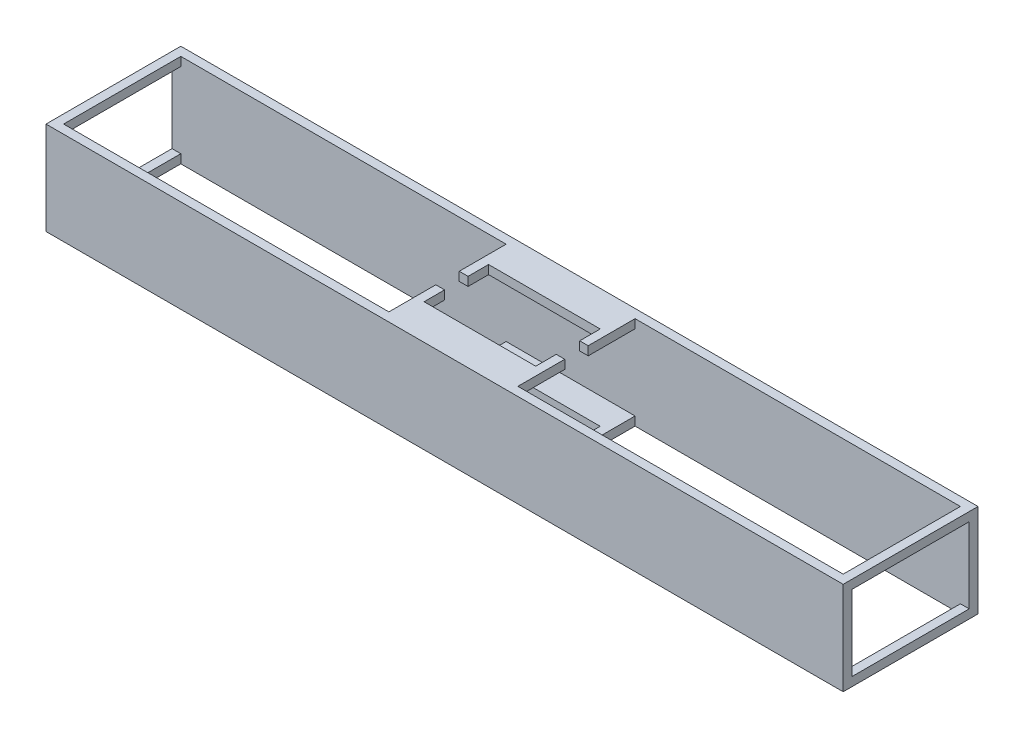
ISO-10303-21;
HEADER;
FILE_DESCRIPTION(('STEP AP214'),'2;1');
FILE_NAME('part.step','',(''),(''),'','','');
FILE_SCHEMA(('AUTOMOTIVE_DESIGN { 1 0 10303 214 1 1 1 1 }'));
ENDSEC;
DATA;
#1=APPLICATION_CONTEXT('core data for automotive mechanical design processes');
#2=APPLICATION_PROTOCOL_DEFINITION('international standard','automotive_design',2000,#1);
#3=PRODUCT_CONTEXT('',#1,'mechanical');
#4=PRODUCT('Part','Part','',(#3));
#5=PRODUCT_RELATED_PRODUCT_CATEGORY('part','',(#4));
#6=PRODUCT_DEFINITION_FORMATION('','',#4);
#7=PRODUCT_DEFINITION_CONTEXT('part definition',#1,'design');
#8=PRODUCT_DEFINITION('design','',#6,#7);
#9=PRODUCT_DEFINITION_SHAPE('','',#8);
#10=(LENGTH_UNIT() NAMED_UNIT(*) SI_UNIT(.MILLI.,.METRE.));
#11=(NAMED_UNIT(*) PLANE_ANGLE_UNIT() SI_UNIT($,.RADIAN.));
#12=(NAMED_UNIT(*) SI_UNIT($,.STERADIAN.) SOLID_ANGLE_UNIT());
#13=UNCERTAINTY_MEASURE_WITH_UNIT(LENGTH_MEASURE(1.E-05),#10,'distance_accuracy_value','');
#14=(GEOMETRIC_REPRESENTATION_CONTEXT(3) GLOBAL_UNCERTAINTY_ASSIGNED_CONTEXT((#13)) GLOBAL_UNIT_ASSIGNED_CONTEXT((#10,
#11,#12)) REPRESENTATION_CONTEXT('',''));
#15=CARTESIAN_POINT('',(0.,0.,0.));
#16=DIRECTION('',(0.,0.,1.));
#17=DIRECTION('',(1.,0.,0.));
#18=AXIS2_PLACEMENT_3D('',#15,#16,#17);
#19=CARTESIAN_POINT('',(-5.49999999999999,0.,-5.));
#20=DIRECTION('',(1.,0.,0.));
#21=DIRECTION('',(0.,0.,-1.));
#22=AXIS2_PLACEMENT_3D('',#19,#20,#21);
#23=PLANE('',#22);
#24=DIRECTION('',(0.,0.,1.));
#25=VECTOR('',#24,1.);
#26=CARTESIAN_POINT('',(-5.49999999999999,7.19,-5.));
#27=LINE('',#26,#25);
#28=CARTESIAN_POINT('',(-5.5,7.19,-5.));
#29=VERTEX_POINT('',#28);
#30=CARTESIAN_POINT('',(-5.49999999999999,7.19,-0.999999999999998));
#31=VERTEX_POINT('',#30);
#32=EDGE_CURVE('E388',#29,#31,#27,.T.);
#33=ORIENTED_EDGE('',*,*,#32,.T.);
#34=DIRECTION('',(0.,1.,0.));
#35=VECTOR('',#34,1.);
#36=CARTESIAN_POINT('',(-5.5,5.44,-0.999999999999998));
#37=LINE('',#36,#35);
#38=CARTESIAN_POINT('',(-5.5,7.94,-0.999999999999998));
#39=VERTEX_POINT('',#38);
#40=EDGE_CURVE('E47',#31,#39,#37,.T.);
#41=ORIENTED_EDGE('',*,*,#40,.T.);
#42=DIRECTION('',(0.,0.,-1.));
#43=VECTOR('',#42,1.);
#44=CARTESIAN_POINT('',(-5.49999999999999,7.94,-5.));
#45=LINE('',#44,#43);
#46=CARTESIAN_POINT('',(-5.49999999999999,7.94,-5.));
#47=VERTEX_POINT('',#46);
#48=EDGE_CURVE('E318',#39,#47,#45,.T.);
#49=ORIENTED_EDGE('',*,*,#48,.T.);
#50=DIRECTION('',(0.,1.,0.));
#51=VECTOR('',#50,1.);
#52=CARTESIAN_POINT('',(-5.49999999999999,0.,-5.));
#53=LINE('',#52,#51);
#54=EDGE_CURVE('E335',#29,#47,#53,.T.);
#55=ORIENTED_EDGE('',*,*,#54,.F.);
#56=EDGE_LOOP('',(#33,#41,#49,#55));
#57=FACE_BOUND('',#56,.T.);
#58=ADVANCED_FACE('F32',(#57),#23,.F.);
#59=CARTESIAN_POINT('',(5.50000000000001,0.,-5.));
#60=DIRECTION('',(-1.,0.,0.));
#61=DIRECTION('',(0.,0.,1.));
#62=AXIS2_PLACEMENT_3D('',#59,#60,#61);
#63=PLANE('',#62);
#64=DIRECTION('',(0.,0.,1.));
#65=VECTOR('',#64,1.);
#66=CARTESIAN_POINT('',(5.50000000000001,7.94,-5.));
#67=LINE('',#66,#65);
#68=CARTESIAN_POINT('',(5.50000000000001,7.94,-5.));
#69=VERTEX_POINT('',#68);
#70=CARTESIAN_POINT('',(5.50000000000001,7.94,-0.999999999999998));
#71=VERTEX_POINT('',#70);
#72=EDGE_CURVE('E461',#69,#71,#67,.T.);
#73=ORIENTED_EDGE('',*,*,#72,.T.);
#74=DIRECTION('',(0.,1.,0.));
#75=VECTOR('',#74,1.);
#76=CARTESIAN_POINT('',(5.50000000000001,5.44,-0.999999999999998));
#77=LINE('',#76,#75);
#78=CARTESIAN_POINT('',(5.50000000000001,7.19,-0.999999999999998));
#79=VERTEX_POINT('',#78);
#80=EDGE_CURVE('E654',#79,#71,#77,.T.);
#81=ORIENTED_EDGE('',*,*,#80,.F.);
#82=DIRECTION('',(0.,0.,-1.));
#83=VECTOR('',#82,1.);
#84=CARTESIAN_POINT('',(5.50000000000001,7.19,-5.));
#85=LINE('',#84,#83);
#86=CARTESIAN_POINT('',(5.50000000000001,7.19,-5.));
#87=VERTEX_POINT('',#86);
#88=EDGE_CURVE('E565',#79,#87,#85,.T.);
#89=ORIENTED_EDGE('',*,*,#88,.T.);
#90=DIRECTION('',(0.,1.,0.));
#91=VECTOR('',#90,1.);
#92=CARTESIAN_POINT('',(5.50000000000001,0.,-5.));
#93=LINE('',#92,#91);
#94=EDGE_CURVE('E476',#87,#69,#93,.T.);
#95=ORIENTED_EDGE('',*,*,#94,.T.);
#96=EDGE_LOOP('',(#73,#81,#89,#95));
#97=FACE_BOUND('',#96,.T.);
#98=ADVANCED_FACE('F653',(#97),#63,.F.);
#99=CARTESIAN_POINT('',(-4.75,0.,-2.75));
#100=DIRECTION('',(-1.,0.,0.));
#101=DIRECTION('',(0.,0.,1.));
#102=AXIS2_PLACEMENT_3D('',#99,#100,#101);
#103=PLANE('',#102);
#104=DIRECTION('',(0.,0.,1.));
#105=VECTOR('',#104,1.);
#106=CARTESIAN_POINT('',(-4.75,7.94,-2.75));
#107=LINE('',#106,#105);
#108=CARTESIAN_POINT('',(-4.75,7.94,-2.75));
#109=VERTEX_POINT('',#108);
#110=CARTESIAN_POINT('',(-4.75,7.94,-0.999999999999998));
#111=VERTEX_POINT('',#110);
#112=EDGE_CURVE('E419',#109,#111,#107,.T.);
#113=ORIENTED_EDGE('',*,*,#112,.T.);
#114=DIRECTION('',(0.,-1.,0.));
#115=VECTOR('',#114,1.);
#116=CARTESIAN_POINT('',(-4.75,0.,-0.999999999999998));
#117=LINE('',#116,#115);
#118=CARTESIAN_POINT('',(-4.75,7.19,-0.999999999999998));
#119=VERTEX_POINT('',#118);
#120=EDGE_CURVE('E669',#111,#119,#117,.T.);
#121=ORIENTED_EDGE('',*,*,#120,.T.);
#122=DIRECTION('',(0.,0.,-1.));
#123=VECTOR('',#122,1.);
#124=CARTESIAN_POINT('',(-4.75,7.19,-2.75));
#125=LINE('',#124,#123);
#126=CARTESIAN_POINT('',(-4.75,7.19,-2.75));
#127=VERTEX_POINT('',#126);
#128=EDGE_CURVE('E391',#119,#127,#125,.T.);
#129=ORIENTED_EDGE('',*,*,#128,.T.);
#130=DIRECTION('',(0.,1.,0.));
#131=VECTOR('',#130,1.);
#132=CARTESIAN_POINT('',(-4.75,0.,-2.75));
#133=LINE('',#132,#131);
#134=EDGE_CURVE('E435',#127,#109,#133,.T.);
#135=ORIENTED_EDGE('',*,*,#134,.T.);
#136=EDGE_LOOP('',(#113,#121,#129,#135));
#137=FACE_BOUND('',#136,.T.);
#138=ADVANCED_FACE('F668',(#137),#103,.F.);
#139=CARTESIAN_POINT('',(4.775,0.,-2.75));
#140=DIRECTION('',(1.,0.,0.));
#141=DIRECTION('',(0.,0.,-1.));
#142=AXIS2_PLACEMENT_3D('',#139,#140,#141);
#143=PLANE('',#142);
#144=DIRECTION('',(0.,0.,1.));
#145=VECTOR('',#144,1.);
#146=CARTESIAN_POINT('',(4.775,7.19,-2.75));
#147=LINE('',#146,#145);
#148=CARTESIAN_POINT('',(4.775,7.19,-2.75));
#149=VERTEX_POINT('',#148);
#150=CARTESIAN_POINT('',(4.775,7.19,-0.999999999999998));
#151=VERTEX_POINT('',#150);
#152=EDGE_CURVE('E556',#149,#151,#147,.T.);
#153=ORIENTED_EDGE('',*,*,#152,.T.);
#154=DIRECTION('',(0.,1.,0.));
#155=VECTOR('',#154,1.);
#156=CARTESIAN_POINT('',(4.775,0.,-0.999999999999998));
#157=LINE('',#156,#155);
#158=CARTESIAN_POINT('',(4.775,7.94,-0.999999999999998));
#159=VERTEX_POINT('',#158);
#160=EDGE_CURVE('E605',#151,#159,#157,.T.);
#161=ORIENTED_EDGE('',*,*,#160,.T.);
#162=DIRECTION('',(0.,0.,-1.));
#163=VECTOR('',#162,1.);
#164=CARTESIAN_POINT('',(4.775,7.94,-2.75));
#165=LINE('',#164,#163);
#166=CARTESIAN_POINT('',(4.775,7.94,-2.75));
#167=VERTEX_POINT('',#166);
#168=EDGE_CURVE('E425',#159,#167,#165,.T.);
#169=ORIENTED_EDGE('',*,*,#168,.T.);
#170=DIRECTION('',(0.,1.,0.));
#171=VECTOR('',#170,1.);
#172=CARTESIAN_POINT('',(4.775,0.,-2.75));
#173=LINE('',#172,#171);
#174=EDGE_CURVE('E439',#149,#167,#173,.T.);
#175=ORIENTED_EDGE('',*,*,#174,.F.);
#176=EDGE_LOOP('',(#153,#161,#169,#175));
#177=FACE_BOUND('',#176,.T.);
#178=ADVANCED_FACE('F660',(#177),#143,.F.);
#179=CARTESIAN_POINT('',(34.,7.19,-5.));
#180=DIRECTION('',(0.,1.,0.));
#181=DIRECTION('',(0.,0.,1.));
#182=AXIS2_PLACEMENT_3D('',#179,#180,#181);
#183=PLANE('',#182);
#184=ORIENTED_EDGE('',*,*,#88,.F.);
#185=DIRECTION('',(-1.,0.,0.));
#186=VECTOR('',#185,1.);
#187=CARTESIAN_POINT('',(34.,7.19,-0.999999999999998));
#188=LINE('',#187,#186);
#189=EDGE_CURVE('E11',#79,#151,#188,.T.);
#190=ORIENTED_EDGE('',*,*,#189,.T.);
#191=ORIENTED_EDGE('',*,*,#152,.F.);
#192=DIRECTION('',(1.,0.,0.));
#193=VECTOR('',#192,1.);
#194=CARTESIAN_POINT('',(-4.75,7.19,-2.75));
#195=LINE('',#194,#193);
#196=EDGE_CURVE('E559',#127,#149,#195,.T.);
#197=ORIENTED_EDGE('',*,*,#196,.F.);
#198=ORIENTED_EDGE('',*,*,#128,.F.);
#199=EDGE_CURVE('E36',#119,#31,#188,.T.);
#200=ORIENTED_EDGE('',*,*,#199,.T.);
#201=ORIENTED_EDGE('',*,*,#32,.F.);
#202=DIRECTION('',(-1.,0.,0.));
#203=VECTOR('',#202,1.);
#204=CARTESIAN_POINT('',(34.,7.19,-5.));
#205=LINE('',#204,#203);
#206=EDGE_CURVE('E512',#87,#29,#205,.T.);
#207=ORIENTED_EDGE('',*,*,#206,.F.);
#208=EDGE_LOOP('',(#184,#190,#191,#197,#198,#200,#201,#207));
#209=FACE_BOUND('',#208,.T.);
#210=ADVANCED_FACE('F386',(#209),#183,.F.);
#211=CARTESIAN_POINT('',(-33.25,0.,-5.));
#212=DIRECTION('',(-1.,0.,0.));
#213=DIRECTION('',(0.,0.,1.));
#214=AXIS2_PLACEMENT_3D('',#211,#212,#213);
#215=PLANE('',#214);
#216=DIRECTION('',(0.,1.,0.));
#217=VECTOR('',#216,1.);
#218=CARTESIAN_POINT('',(-33.25,0.,5.));
#219=LINE('',#218,#217);
#220=CARTESIAN_POINT('',(-33.25,7.19,5.));
#221=VERTEX_POINT('',#220);
#222=CARTESIAN_POINT('',(-33.25,7.94,5.));
#223=VERTEX_POINT('',#222);
#224=EDGE_CURVE('E342',#221,#223,#219,.T.);
#225=ORIENTED_EDGE('',*,*,#224,.F.);
#226=DIRECTION('',(0.,0.,-1.));
#227=VECTOR('',#226,1.);
#228=CARTESIAN_POINT('',(-33.25,7.19,-5.));
#229=LINE('',#228,#227);
#230=CARTESIAN_POINT('',(-33.25,7.19,-5.));
#231=VERTEX_POINT('',#230);
#232=EDGE_CURVE('E396',#221,#231,#229,.T.);
#233=ORIENTED_EDGE('',*,*,#232,.T.);
#234=DIRECTION('',(0.,1.,0.));
#235=VECTOR('',#234,1.);
#236=CARTESIAN_POINT('',(-33.25,0.,-5.));
#237=LINE('',#236,#235);
#238=CARTESIAN_POINT('',(-33.25,7.94,-5.));
#239=VERTEX_POINT('',#238);
#240=EDGE_CURVE('E331',#231,#239,#237,.T.);
#241=ORIENTED_EDGE('',*,*,#240,.T.);
#242=DIRECTION('',(0.,0.,1.));
#243=VECTOR('',#242,1.);
#244=CARTESIAN_POINT('',(-33.25,7.94,-5.));
#245=LINE('',#244,#243);
#246=EDGE_CURVE('E475',#239,#223,#245,.T.);
#247=ORIENTED_EDGE('',*,*,#246,.T.);
#248=EDGE_LOOP('',(#225,#233,#241,#247));
#249=FACE_BOUND('',#248,.T.);
#250=ADVANCED_FACE('F697',(#249),#215,.F.);
#251=CARTESIAN_POINT('',(-5.49999999999999,7.94,5.));
#252=VERTEX_POINT('',#251);
#253=CARTESIAN_POINT('',(-5.49999999999999,7.94,1.));
#254=VERTEX_POINT('',#253);
#255=EDGE_CURVE('E307',#252,#254,#45,.T.);
#256=ORIENTED_EDGE('',*,*,#255,.T.);
#257=DIRECTION('',(0.,1.,0.));
#258=VECTOR('',#257,1.);
#259=CARTESIAN_POINT('',(-5.49999999999999,5.44,1.));
#260=LINE('',#259,#258);
#261=CARTESIAN_POINT('',(-5.49999999999999,7.19,1.));
#262=VERTEX_POINT('',#261);
#263=EDGE_CURVE('E288',#262,#254,#260,.T.);
#264=ORIENTED_EDGE('',*,*,#263,.F.);
#265=CARTESIAN_POINT('',(-5.5,7.19,5.));
#266=VERTEX_POINT('',#265);
#267=EDGE_CURVE('E397',#262,#266,#27,.T.);
#268=ORIENTED_EDGE('',*,*,#267,.T.);
#269=DIRECTION('',(0.,1.,0.));
#270=VECTOR('',#269,1.);
#271=CARTESIAN_POINT('',(-5.49999999999999,0.,5.));
#272=LINE('',#271,#270);
#273=EDGE_CURVE('E315',#266,#252,#272,.T.);
#274=ORIENTED_EDGE('',*,*,#273,.T.);
#275=EDGE_LOOP('',(#256,#264,#268,#274));
#276=FACE_BOUND('',#275,.T.);
#277=ADVANCED_FACE('F313',(#276),#23,.F.);
#278=CARTESIAN_POINT('',(5.50000000000001,7.19,5.));
#279=VERTEX_POINT('',#278);
#280=CARTESIAN_POINT('',(5.50000000000001,7.19,1.));
#281=VERTEX_POINT('',#280);
#282=EDGE_CURVE('E401',#279,#281,#85,.T.);
#283=ORIENTED_EDGE('',*,*,#282,.T.);
#284=DIRECTION('',(0.,1.,0.));
#285=VECTOR('',#284,1.);
#286=CARTESIAN_POINT('',(5.50000000000001,5.44,1.));
#287=LINE('',#286,#285);
#288=CARTESIAN_POINT('',(5.50000000000001,7.94,1.));
#289=VERTEX_POINT('',#288);
#290=EDGE_CURVE('E55',#281,#289,#287,.T.);
#291=ORIENTED_EDGE('',*,*,#290,.T.);
#292=CARTESIAN_POINT('',(5.50000000000001,7.94,5.));
#293=VERTEX_POINT('',#292);
#294=EDGE_CURVE('E434',#289,#293,#67,.T.);
#295=ORIENTED_EDGE('',*,*,#294,.T.);
#296=DIRECTION('',(0.,1.,0.));
#297=VECTOR('',#296,1.);
#298=CARTESIAN_POINT('',(5.50000000000001,0.,5.));
#299=LINE('',#298,#297);
#300=EDGE_CURVE('E460',#279,#293,#299,.T.);
#301=ORIENTED_EDGE('',*,*,#300,.F.);
#302=EDGE_LOOP('',(#283,#291,#295,#301));
#303=FACE_BOUND('',#302,.T.);
#304=ADVANCED_FACE('F573',(#303),#63,.F.);
#305=CARTESIAN_POINT('',(33.25,0.,-5.));
#306=DIRECTION('',(1.,0.,0.));
#307=DIRECTION('',(0.,0.,-1.));
#308=AXIS2_PLACEMENT_3D('',#305,#306,#307);
#309=PLANE('',#308);
#310=DIRECTION('',(0.,1.,0.));
#311=VECTOR('',#310,1.);
#312=CARTESIAN_POINT('',(33.25,0.,-5.));
#313=LINE('',#312,#311);
#314=CARTESIAN_POINT('',(33.25,7.19,-5.));
#315=VERTEX_POINT('',#314);
#316=CARTESIAN_POINT('',(33.25,7.94,-5.));
#317=VERTEX_POINT('',#316);
#318=EDGE_CURVE('E480',#315,#317,#313,.T.);
#319=ORIENTED_EDGE('',*,*,#318,.F.);
#320=DIRECTION('',(0.,0.,1.));
#321=VECTOR('',#320,1.);
#322=CARTESIAN_POINT('',(33.25,7.19,-5.));
#323=LINE('',#322,#321);
#324=CARTESIAN_POINT('',(33.25,7.19,5.));
#325=VERTEX_POINT('',#324);
#326=EDGE_CURVE('E563',#315,#325,#323,.T.);
#327=ORIENTED_EDGE('',*,*,#326,.T.);
#328=DIRECTION('',(0.,1.,0.));
#329=VECTOR('',#328,1.);
#330=CARTESIAN_POINT('',(33.25,0.,5.));
#331=LINE('',#330,#329);
#332=CARTESIAN_POINT('',(33.25,7.94,5.));
#333=VERTEX_POINT('',#332);
#334=EDGE_CURVE('E484',#325,#333,#331,.T.);
#335=ORIENTED_EDGE('',*,*,#334,.T.);
#336=DIRECTION('',(0.,0.,-1.));
#337=VECTOR('',#336,1.);
#338=CARTESIAN_POINT('',(33.25,7.94,-5.));
#339=LINE('',#338,#337);
#340=EDGE_CURVE('E467',#333,#317,#339,.T.);
#341=ORIENTED_EDGE('',*,*,#340,.T.);
#342=EDGE_LOOP('',(#319,#327,#335,#341));
#343=FACE_BOUND('',#342,.T.);
#344=ADVANCED_FACE('F647',(#343),#309,.F.);
#345=CARTESIAN_POINT('',(-4.75,7.19,2.75));
#346=VERTEX_POINT('',#345);
#347=CARTESIAN_POINT('',(-4.75,7.19,1.));
#348=VERTEX_POINT('',#347);
#349=EDGE_CURVE('E562',#346,#348,#125,.T.);
#350=ORIENTED_EDGE('',*,*,#349,.T.);
#351=DIRECTION('',(0.,1.,0.));
#352=VECTOR('',#351,1.);
#353=CARTESIAN_POINT('',(-4.75,0.,1.));
#354=LINE('',#353,#352);
#355=CARTESIAN_POINT('',(-4.75,7.94,1.));
#356=VERTEX_POINT('',#355);
#357=EDGE_CURVE('E670',#348,#356,#354,.T.);
#358=ORIENTED_EDGE('',*,*,#357,.T.);
#359=CARTESIAN_POINT('',(-4.75,7.94,2.75));
#360=VERTEX_POINT('',#359);
#361=EDGE_CURVE('E309',#356,#360,#107,.T.);
#362=ORIENTED_EDGE('',*,*,#361,.T.);
#363=DIRECTION('',(0.,1.,0.));
#364=VECTOR('',#363,1.);
#365=CARTESIAN_POINT('',(-4.75,0.,2.75));
#366=LINE('',#365,#364);
#367=EDGE_CURVE('E418',#346,#360,#366,.T.);
#368=ORIENTED_EDGE('',*,*,#367,.F.);
#369=EDGE_LOOP('',(#350,#358,#362,#368));
#370=FACE_BOUND('',#369,.T.);
#371=ADVANCED_FACE('F718',(#370),#103,.F.);
#372=CARTESIAN_POINT('',(-4.75,0.,-2.75));
#373=DIRECTION('',(0.,0.,-1.));
#374=DIRECTION('',(-1.,0.,0.));
#375=AXIS2_PLACEMENT_3D('',#372,#373,#374);
#376=PLANE('',#375);
#377=ORIENTED_EDGE('',*,*,#134,.F.);
#378=ORIENTED_EDGE('',*,*,#196,.T.);
#379=ORIENTED_EDGE('',*,*,#174,.T.);
#380=DIRECTION('',(-1.,0.,0.));
#381=VECTOR('',#380,1.);
#382=CARTESIAN_POINT('',(-4.75,7.94,-2.75));
#383=LINE('',#382,#381);
#384=EDGE_CURVE('E409',#167,#109,#383,.T.);
#385=ORIENTED_EDGE('',*,*,#384,.T.);
#386=EDGE_LOOP('',(#377,#378,#379,#385));
#387=FACE_BOUND('',#386,.T.);
#388=ADVANCED_FACE('F665',(#387),#376,.F.);
#389=CARTESIAN_POINT('',(4.775,7.94,2.75));
#390=VERTEX_POINT('',#389);
#391=CARTESIAN_POINT('',(4.775,7.94,1.));
#392=VERTEX_POINT('',#391);
#393=EDGE_CURVE('E426',#390,#392,#165,.T.);
#394=ORIENTED_EDGE('',*,*,#393,.T.);
#395=DIRECTION('',(0.,-1.,0.));
#396=VECTOR('',#395,1.);
#397=CARTESIAN_POINT('',(4.775,0.,1.));
#398=LINE('',#397,#396);
#399=CARTESIAN_POINT('',(4.775,7.19,1.));
#400=VERTEX_POINT('',#399);
#401=EDGE_CURVE('E671',#392,#400,#398,.T.);
#402=ORIENTED_EDGE('',*,*,#401,.T.);
#403=CARTESIAN_POINT('',(4.775,7.19,2.75));
#404=VERTEX_POINT('',#403);
#405=EDGE_CURVE('E555',#400,#404,#147,.T.);
#406=ORIENTED_EDGE('',*,*,#405,.T.);
#407=DIRECTION('',(0.,1.,0.));
#408=VECTOR('',#407,1.);
#409=CARTESIAN_POINT('',(4.775,0.,2.75));
#410=LINE('',#409,#408);
#411=EDGE_CURVE('E443',#404,#390,#410,.T.);
#412=ORIENTED_EDGE('',*,*,#411,.T.);
#413=EDGE_LOOP('',(#394,#402,#406,#412));
#414=FACE_BOUND('',#413,.T.);
#415=ADVANCED_FACE('F728',(#414),#143,.F.);
#416=CARTESIAN_POINT('',(-4.75,0.,2.75));
#417=DIRECTION('',(0.,0.,1.));
#418=DIRECTION('',(1.,0.,0.));
#419=AXIS2_PLACEMENT_3D('',#416,#417,#418);
#420=PLANE('',#419);
#421=ORIENTED_EDGE('',*,*,#411,.F.);
#422=DIRECTION('',(-1.,0.,0.));
#423=VECTOR('',#422,1.);
#424=CARTESIAN_POINT('',(-4.75,7.19,2.75));
#425=LINE('',#424,#423);
#426=EDGE_CURVE('E375',#404,#346,#425,.T.);
#427=ORIENTED_EDGE('',*,*,#426,.T.);
#428=ORIENTED_EDGE('',*,*,#367,.T.);
#429=DIRECTION('',(1.,0.,0.));
#430=VECTOR('',#429,1.);
#431=CARTESIAN_POINT('',(-4.75,7.94,2.75));
#432=LINE('',#431,#430);
#433=EDGE_CURVE('E422',#360,#390,#432,.T.);
#434=ORIENTED_EDGE('',*,*,#433,.T.);
#435=EDGE_LOOP('',(#421,#427,#428,#434));
#436=FACE_BOUND('',#435,.T.);
#437=ADVANCED_FACE('F724',(#436),#420,.F.);
#438=CARTESIAN_POINT('',(34.,7.94,5.75));
#439=DIRECTION('',(-1.,0.,0.));
#440=DIRECTION('',(0.,0.,1.));
#441=AXIS2_PLACEMENT_3D('',#438,#439,#440);
#442=PLANE('',#441);
#443=DIRECTION('',(0.,0.,-1.));
#444=VECTOR('',#443,1.);
#445=CARTESIAN_POINT('',(34.,7.19,-5.));
#446=LINE('',#445,#444);
#447=CARTESIAN_POINT('',(34.,7.19,5.));
#448=VERTEX_POINT('',#447);
#449=CARTESIAN_POINT('',(34.,7.19,-5.));
#450=VERTEX_POINT('',#449);
#451=EDGE_CURVE('E610',#448,#450,#446,.T.);
#452=ORIENTED_EDGE('',*,*,#451,.T.);
#453=DIRECTION('',(0.,-1.,0.));
#454=VECTOR('',#453,1.);
#455=CARTESIAN_POINT('',(34.,7.19,-5.));
#456=LINE('',#455,#454);
#457=CARTESIAN_POINT('',(34.,0.750000000000001,-5.));
#458=VERTEX_POINT('',#457);
#459=EDGE_CURVE('E594',#450,#458,#456,.T.);
#460=ORIENTED_EDGE('',*,*,#459,.T.);
#461=DIRECTION('',(0.,0.,1.));
#462=VECTOR('',#461,1.);
#463=CARTESIAN_POINT('',(34.,0.750000000000001,-5.));
#464=LINE('',#463,#462);
#465=CARTESIAN_POINT('',(34.,0.750000000000001,5.));
#466=VERTEX_POINT('',#465);
#467=EDGE_CURVE('E596',#458,#466,#464,.T.);
#468=ORIENTED_EDGE('',*,*,#467,.T.);
#469=DIRECTION('',(0.,1.,0.));
#470=VECTOR('',#469,1.);
#471=CARTESIAN_POINT('',(34.,7.19,5.));
#472=LINE('',#471,#470);
#473=EDGE_CURVE('E602',#466,#448,#472,.T.);
#474=ORIENTED_EDGE('',*,*,#473,.T.);
#475=EDGE_LOOP('',(#452,#460,#468,#474));
#476=FACE_BOUND('',#475,.T.);
#477=DIRECTION('',(0.,0.,-1.));
#478=VECTOR('',#477,1.);
#479=CARTESIAN_POINT('',(34.,0.,5.75));
#480=LINE('',#479,#478);
#481=CARTESIAN_POINT('',(34.,0.,5.75));
#482=VERTEX_POINT('',#481);
#483=CARTESIAN_POINT('',(34.,0.,-5.75));
#484=VERTEX_POINT('',#483);
#485=EDGE_CURVE('E330',#482,#484,#480,.T.);
#486=ORIENTED_EDGE('',*,*,#485,.T.);
#487=DIRECTION('',(0.,-1.,0.));
#488=VECTOR('',#487,1.);
#489=CARTESIAN_POINT('',(34.,7.94,-5.75));
#490=LINE('',#489,#488);
#491=CARTESIAN_POINT('',(34.,7.94,-5.75));
#492=VERTEX_POINT('',#491);
#493=EDGE_CURVE('E369',#492,#484,#490,.T.);
#494=ORIENTED_EDGE('',*,*,#493,.F.);
#495=DIRECTION('',(0.,0.,-1.));
#496=VECTOR('',#495,1.);
#497=CARTESIAN_POINT('',(34.,7.94,5.75));
#498=LINE('',#497,#496);
#499=CARTESIAN_POINT('',(34.,7.94,5.75));
#500=VERTEX_POINT('',#499);
#501=EDGE_CURVE('E343',#500,#492,#498,.T.);
#502=ORIENTED_EDGE('',*,*,#501,.F.);
#503=DIRECTION('',(0.,-1.,0.));
#504=VECTOR('',#503,1.);
#505=CARTESIAN_POINT('',(34.,7.94,5.75));
#506=LINE('',#505,#504);
#507=EDGE_CURVE('E353',#500,#482,#506,.T.);
#508=ORIENTED_EDGE('',*,*,#507,.T.);
#509=EDGE_LOOP('',(#486,#494,#502,#508));
#510=FACE_BOUND('',#509,.T.);
#511=ADVANCED_FACE('F34',(#476,#510),#442,.F.);
#512=CARTESIAN_POINT('',(-34.,7.94,-5.75));
#513=DIRECTION('',(0.,0.,1.));
#514=DIRECTION('',(1.,0.,0.));
#515=AXIS2_PLACEMENT_3D('',#512,#513,#514);
#516=PLANE('',#515);
#517=DIRECTION('',(-1.,0.,0.));
#518=VECTOR('',#517,1.);
#519=CARTESIAN_POINT('',(-34.,0.,-5.75));
#520=LINE('',#519,#518);
#521=CARTESIAN_POINT('',(-34.,0.,-5.75));
#522=VERTEX_POINT('',#521);
#523=EDGE_CURVE('E356',#484,#522,#520,.T.);
#524=ORIENTED_EDGE('',*,*,#523,.T.);
#525=DIRECTION('',(0.,-1.,0.));
#526=VECTOR('',#525,1.);
#527=CARTESIAN_POINT('',(-34.,7.94,-5.75));
#528=LINE('',#527,#526);
#529=CARTESIAN_POINT('',(-34.,7.94,-5.75));
#530=VERTEX_POINT('',#529);
#531=EDGE_CURVE('E366',#530,#522,#528,.T.);
#532=ORIENTED_EDGE('',*,*,#531,.F.);
#533=DIRECTION('',(-1.,0.,0.));
#534=VECTOR('',#533,1.);
#535=CARTESIAN_POINT('',(-34.,7.94,-5.75));
#536=LINE('',#535,#534);
#537=EDGE_CURVE('E346',#492,#530,#536,.T.);
#538=ORIENTED_EDGE('',*,*,#537,.F.);
#539=ORIENTED_EDGE('',*,*,#493,.T.);
#540=EDGE_LOOP('',(#524,#532,#538,#539));
#541=FACE_BOUND('',#540,.T.);
#542=ADVANCED_FACE('F768',(#541),#516,.F.);
#543=CARTESIAN_POINT('',(-34.,7.94,5.75));
#544=DIRECTION('',(1.,0.,0.));
#545=DIRECTION('',(0.,0.,-1.));
#546=AXIS2_PLACEMENT_3D('',#543,#544,#545);
#547=PLANE('',#546);
#548=DIRECTION('',(0.,0.,1.));
#549=VECTOR('',#548,1.);
#550=CARTESIAN_POINT('',(-34.,0.750000000000001,-5.));
#551=LINE('',#550,#549);
#552=CARTESIAN_POINT('',(-34.,0.750000000000001,-5.));
#553=VERTEX_POINT('',#552);
#554=CARTESIAN_POINT('',(-34.,0.750000000000001,5.));
#555=VERTEX_POINT('',#554);
#556=EDGE_CURVE('E590',#553,#555,#551,.T.);
#557=ORIENTED_EDGE('',*,*,#556,.F.);
#558=DIRECTION('',(0.,-1.,0.));
#559=VECTOR('',#558,1.);
#560=CARTESIAN_POINT('',(-34.,7.19,-5.));
#561=LINE('',#560,#559);
#562=CARTESIAN_POINT('',(-34.,7.19,-5.));
#563=VERTEX_POINT('',#562);
#564=EDGE_CURVE('E593',#563,#553,#561,.T.);
#565=ORIENTED_EDGE('',*,*,#564,.F.);
#566=DIRECTION('',(0.,0.,-1.));
#567=VECTOR('',#566,1.);
#568=CARTESIAN_POINT('',(-34.,7.19,-5.));
#569=LINE('',#568,#567);
#570=CARTESIAN_POINT('',(-34.,7.19,5.));
#571=VERTEX_POINT('',#570);
#572=EDGE_CURVE('E521',#571,#563,#569,.T.);
#573=ORIENTED_EDGE('',*,*,#572,.F.);
#574=DIRECTION('',(0.,1.,0.));
#575=VECTOR('',#574,1.);
#576=CARTESIAN_POINT('',(-34.,7.19,5.));
#577=LINE('',#576,#575);
#578=EDGE_CURVE('E586',#555,#571,#577,.T.);
#579=ORIENTED_EDGE('',*,*,#578,.F.);
#580=EDGE_LOOP('',(#557,#565,#573,#579));
#581=FACE_BOUND('',#580,.T.);
#582=DIRECTION('',(0.,0.,1.));
#583=VECTOR('',#582,1.);
#584=CARTESIAN_POINT('',(-34.,0.,5.75));
#585=LINE('',#584,#583);
#586=CARTESIAN_POINT('',(-34.,0.,5.75));
#587=VERTEX_POINT('',#586);
#588=EDGE_CURVE('E358',#522,#587,#585,.T.);
#589=ORIENTED_EDGE('',*,*,#588,.T.);
#590=DIRECTION('',(0.,-1.,0.));
#591=VECTOR('',#590,1.);
#592=CARTESIAN_POINT('',(-34.,7.94,5.75));
#593=LINE('',#592,#591);
#594=CARTESIAN_POINT('',(-34.,7.94,5.75));
#595=VERTEX_POINT('',#594);
#596=EDGE_CURVE('E363',#595,#587,#593,.T.);
#597=ORIENTED_EDGE('',*,*,#596,.F.);
#598=DIRECTION('',(0.,0.,1.));
#599=VECTOR('',#598,1.);
#600=CARTESIAN_POINT('',(-34.,7.94,5.75));
#601=LINE('',#600,#599);
#602=EDGE_CURVE('E349',#530,#595,#601,.T.);
#603=ORIENTED_EDGE('',*,*,#602,.F.);
#604=ORIENTED_EDGE('',*,*,#531,.T.);
#605=EDGE_LOOP('',(#589,#597,#603,#604));
#606=FACE_BOUND('',#605,.T.);
#607=ADVANCED_FACE('F591',(#581,#606),#547,.F.);
#608=CARTESIAN_POINT('',(-34.,7.94,5.75));
#609=DIRECTION('',(0.,0.,-1.));
#610=DIRECTION('',(-1.,0.,0.));
#611=AXIS2_PLACEMENT_3D('',#608,#609,#610);
#612=PLANE('',#611);
#613=DIRECTION('',(1.,0.,0.));
#614=VECTOR('',#613,1.);
#615=CARTESIAN_POINT('',(-34.,0.,5.75));
#616=LINE('',#615,#614);
#617=EDGE_CURVE('E347',#587,#482,#616,.T.);
#618=ORIENTED_EDGE('',*,*,#617,.T.);
#619=ORIENTED_EDGE('',*,*,#507,.F.);
#620=DIRECTION('',(1.,0.,0.));
#621=VECTOR('',#620,1.);
#622=CARTESIAN_POINT('',(-34.,7.94,5.75));
#623=LINE('',#622,#621);
#624=EDGE_CURVE('E351',#595,#500,#623,.T.);
#625=ORIENTED_EDGE('',*,*,#624,.F.);
#626=ORIENTED_EDGE('',*,*,#596,.T.);
#627=EDGE_LOOP('',(#618,#619,#625,#626));
#628=FACE_BOUND('',#627,.T.);
#629=ADVANCED_FACE('F761',(#628),#612,.F.);
#630=CARTESIAN_POINT('',(0.,7.94,0.));
#631=DIRECTION('',(0.,-1.,0.));
#632=DIRECTION('',(0.,0.,-1.));
#633=AXIS2_PLACEMENT_3D('',#630,#631,#632);
#634=PLANE('',#633);
#635=ORIENTED_EDGE('',*,*,#48,.F.);
#636=DIRECTION('',(-1.,0.,0.));
#637=VECTOR('',#636,1.);
#638=CARTESIAN_POINT('',(-5.5,7.94,-0.999999999999998));
#639=LINE('',#638,#637);
#640=EDGE_CURVE('E310',#111,#39,#639,.T.);
#641=ORIENTED_EDGE('',*,*,#640,.F.);
#642=ORIENTED_EDGE('',*,*,#112,.F.);
#643=ORIENTED_EDGE('',*,*,#384,.F.);
#644=ORIENTED_EDGE('',*,*,#168,.F.);
#645=EDGE_CURVE('E298',#71,#159,#639,.T.);
#646=ORIENTED_EDGE('',*,*,#645,.F.);
#647=ORIENTED_EDGE('',*,*,#72,.F.);
#648=DIRECTION('',(-1.,0.,0.));
#649=VECTOR('',#648,1.);
#650=CARTESIAN_POINT('',(5.50000000000001,7.94,-5.));
#651=LINE('',#650,#649);
#652=EDGE_CURVE('E451',#317,#69,#651,.T.);
#653=ORIENTED_EDGE('',*,*,#652,.F.);
#654=ORIENTED_EDGE('',*,*,#340,.F.);
#655=DIRECTION('',(1.,0.,0.));
#656=VECTOR('',#655,1.);
#657=CARTESIAN_POINT('',(5.50000000000001,7.94,5.));
#658=LINE('',#657,#656);
#659=EDGE_CURVE('E464',#293,#333,#658,.T.);
#660=ORIENTED_EDGE('',*,*,#659,.F.);
#661=ORIENTED_EDGE('',*,*,#294,.F.);
#662=DIRECTION('',(1.,0.,0.));
#663=VECTOR('',#662,1.);
#664=CARTESIAN_POINT('',(-5.49999999999999,7.94,1.));
#665=LINE('',#664,#663);
#666=EDGE_CURVE('E311',#392,#289,#665,.T.);
#667=ORIENTED_EDGE('',*,*,#666,.F.);
#668=ORIENTED_EDGE('',*,*,#393,.F.);
#669=ORIENTED_EDGE('',*,*,#433,.F.);
#670=ORIENTED_EDGE('',*,*,#361,.F.);
#671=EDGE_CURVE('E291',#254,#356,#665,.T.);
#672=ORIENTED_EDGE('',*,*,#671,.F.);
#673=ORIENTED_EDGE('',*,*,#255,.F.);
#674=DIRECTION('',(1.,0.,0.));
#675=VECTOR('',#674,1.);
#676=CARTESIAN_POINT('',(-33.25,7.94,5.));
#677=LINE('',#676,#675);
#678=EDGE_CURVE('E323',#223,#252,#677,.T.);
#679=ORIENTED_EDGE('',*,*,#678,.F.);
#680=ORIENTED_EDGE('',*,*,#246,.F.);
#681=DIRECTION('',(-1.,0.,0.));
#682=VECTOR('',#681,1.);
#683=CARTESIAN_POINT('',(-33.25,7.94,-5.));
#684=LINE('',#683,#682);
#685=EDGE_CURVE('E317',#47,#239,#684,.T.);
#686=ORIENTED_EDGE('',*,*,#685,.F.);
#687=EDGE_LOOP('',(#635,#641,#642,#643,#644,#646,#647,#653,#654,#660,#661,#667,#668,#669,#670,
#672,#673,#679,#680,#686));
#688=FACE_BOUND('',#687,.T.);
#689=ORIENTED_EDGE('',*,*,#501,.T.);
#690=ORIENTED_EDGE('',*,*,#537,.T.);
#691=ORIENTED_EDGE('',*,*,#602,.T.);
#692=ORIENTED_EDGE('',*,*,#624,.T.);
#693=EDGE_LOOP('',(#689,#690,#691,#692));
#694=FACE_BOUND('',#693,.T.);
#695=ADVANCED_FACE('F304',(#688,#694),#634,.F.);
#696=CARTESIAN_POINT('',(0.,0.,0.));
#697=DIRECTION('',(0.,-1.,0.));
#698=DIRECTION('',(0.,0.,-1.));
#699=AXIS2_PLACEMENT_3D('',#696,#697,#698);
#700=PLANE('',#699);
#701=DIRECTION('',(0.,0.,1.));
#702=VECTOR('',#701,1.);
#703=CARTESIAN_POINT('',(-4.75,0.,-2.75));
#704=LINE('',#703,#702);
#705=CARTESIAN_POINT('',(-4.75,0.,-2.75));
#706=VERTEX_POINT('',#705);
#707=CARTESIAN_POINT('',(-4.75,0.,2.75));
#708=VERTEX_POINT('',#707);
#709=EDGE_CURVE('E405',#706,#708,#704,.T.);
#710=ORIENTED_EDGE('',*,*,#709,.T.);
#711=DIRECTION('',(1.,0.,0.));
#712=VECTOR('',#711,1.);
#713=CARTESIAN_POINT('',(-4.75,0.,2.75));
#714=LINE('',#713,#712);
#715=CARTESIAN_POINT('',(4.775,0.,2.75));
#716=VERTEX_POINT('',#715);
#717=EDGE_CURVE('E408',#708,#716,#714,.T.);
#718=ORIENTED_EDGE('',*,*,#717,.T.);
#719=DIRECTION('',(0.,0.,-1.));
#720=VECTOR('',#719,1.);
#721=CARTESIAN_POINT('',(4.775,0.,-2.75));
#722=LINE('',#721,#720);
#723=CARTESIAN_POINT('',(4.775,0.,-2.75));
#724=VERTEX_POINT('',#723);
#725=EDGE_CURVE('E412',#716,#724,#722,.T.);
#726=ORIENTED_EDGE('',*,*,#725,.T.);
#727=DIRECTION('',(-1.,0.,0.));
#728=VECTOR('',#727,1.);
#729=CARTESIAN_POINT('',(-4.75,0.,-2.75));
#730=LINE('',#729,#728);
#731=EDGE_CURVE('E415',#724,#706,#730,.T.);
#732=ORIENTED_EDGE('',*,*,#731,.T.);
#733=EDGE_LOOP('',(#710,#718,#726,#732));
#734=FACE_BOUND('',#733,.T.);
#735=DIRECTION('',(0.,0.,1.));
#736=VECTOR('',#735,1.);
#737=CARTESIAN_POINT('',(5.50000000000001,0.,-5.));
#738=LINE('',#737,#736);
#739=CARTESIAN_POINT('',(5.50000000000001,0.,-5.));
#740=VERTEX_POINT('',#739);
#741=CARTESIAN_POINT('',(5.50000000000001,0.,5.));
#742=VERTEX_POINT('',#741);
#743=EDGE_CURVE('E447',#740,#742,#738,.T.);
#744=ORIENTED_EDGE('',*,*,#743,.T.);
#745=DIRECTION('',(1.,0.,0.));
#746=VECTOR('',#745,1.);
#747=CARTESIAN_POINT('',(5.50000000000001,0.,5.));
#748=LINE('',#747,#746);
#749=CARTESIAN_POINT('',(33.25,0.,5.));
#750=VERTEX_POINT('',#749);
#751=EDGE_CURVE('E450',#742,#750,#748,.T.);
#752=ORIENTED_EDGE('',*,*,#751,.T.);
#753=DIRECTION('',(0.,0.,-1.));
#754=VECTOR('',#753,1.);
#755=CARTESIAN_POINT('',(33.25,0.,-5.));
#756=LINE('',#755,#754);
#757=CARTESIAN_POINT('',(33.25,0.,-5.));
#758=VERTEX_POINT('',#757);
#759=EDGE_CURVE('E454',#750,#758,#756,.T.);
#760=ORIENTED_EDGE('',*,*,#759,.T.);
#761=DIRECTION('',(-1.,0.,0.));
#762=VECTOR('',#761,1.);
#763=CARTESIAN_POINT('',(5.50000000000001,0.,-5.));
#764=LINE('',#763,#762);
#765=EDGE_CURVE('E457',#758,#740,#764,.T.);
#766=ORIENTED_EDGE('',*,*,#765,.T.);
#767=EDGE_LOOP('',(#744,#752,#760,#766));
#768=FACE_BOUND('',#767,.T.);
#769=DIRECTION('',(0.,0.,1.));
#770=VECTOR('',#769,1.);
#771=CARTESIAN_POINT('',(-33.25,0.,-5.));
#772=LINE('',#771,#770);
#773=CARTESIAN_POINT('',(-33.25,0.,-5.));
#774=VERTEX_POINT('',#773);
#775=CARTESIAN_POINT('',(-33.25,0.,5.));
#776=VERTEX_POINT('',#775);
#777=EDGE_CURVE('E321',#774,#776,#772,.T.);
#778=ORIENTED_EDGE('',*,*,#777,.T.);
#779=DIRECTION('',(1.,0.,0.));
#780=VECTOR('',#779,1.);
#781=CARTESIAN_POINT('',(-33.25,0.,5.));
#782=LINE('',#781,#780);
#783=CARTESIAN_POINT('',(-5.49999999999999,0.,5.));
#784=VERTEX_POINT('',#783);
#785=EDGE_CURVE('E490',#776,#784,#782,.T.);
#786=ORIENTED_EDGE('',*,*,#785,.T.);
#787=DIRECTION('',(0.,0.,-1.));
#788=VECTOR('',#787,1.);
#789=CARTESIAN_POINT('',(-5.49999999999999,0.,-5.));
#790=LINE('',#789,#788);
#791=CARTESIAN_POINT('',(-5.49999999999999,0.,-5.));
#792=VERTEX_POINT('',#791);
#793=EDGE_CURVE('E493',#784,#792,#790,.T.);
#794=ORIENTED_EDGE('',*,*,#793,.T.);
#795=DIRECTION('',(-1.,0.,0.));
#796=VECTOR('',#795,1.);
#797=CARTESIAN_POINT('',(-33.25,0.,-5.));
#798=LINE('',#797,#796);
#799=EDGE_CURVE('E496',#792,#774,#798,.T.);
#800=ORIENTED_EDGE('',*,*,#799,.T.);
#801=EDGE_LOOP('',(#778,#786,#794,#800));
#802=FACE_BOUND('',#801,.T.);
#803=ORIENTED_EDGE('',*,*,#485,.F.);
#804=ORIENTED_EDGE('',*,*,#617,.F.);
#805=ORIENTED_EDGE('',*,*,#588,.F.);
#806=ORIENTED_EDGE('',*,*,#523,.F.);
#807=EDGE_LOOP('',(#803,#804,#805,#806));
#808=FACE_BOUND('',#807,.T.);
#809=ADVANCED_FACE('F627',(#734,#768,#802,#808),#700,.T.);
#810=CARTESIAN_POINT('',(-33.25,0.750000000000001,-5.));
#811=VERTEX_POINT('',#810);
#812=EDGE_CURVE('E327',#774,#811,#237,.T.);
#813=ORIENTED_EDGE('',*,*,#812,.T.);
#814=DIRECTION('',(0.,0.,1.));
#815=VECTOR('',#814,1.);
#816=CARTESIAN_POINT('',(-33.25,0.750000000000001,-5.));
#817=LINE('',#816,#815);
#818=CARTESIAN_POINT('',(-33.25,0.750000000000001,5.));
#819=VERTEX_POINT('',#818);
#820=EDGE_CURVE('E552',#811,#819,#817,.T.);
#821=ORIENTED_EDGE('',*,*,#820,.T.);
#822=EDGE_CURVE('E339',#776,#819,#219,.T.);
#823=ORIENTED_EDGE('',*,*,#822,.F.);
#824=ORIENTED_EDGE('',*,*,#777,.F.);
#825=EDGE_LOOP('',(#813,#821,#823,#824));
#826=FACE_BOUND('',#825,.T.);
#827=ADVANCED_FACE('F703',(#826),#215,.F.);
#828=CARTESIAN_POINT('',(-33.25,0.,-5.));
#829=DIRECTION('',(0.,0.,-1.));
#830=DIRECTION('',(-1.,0.,0.));
#831=AXIS2_PLACEMENT_3D('',#828,#829,#830);
#832=PLANE('',#831);
#833=CARTESIAN_POINT('',(-5.49999999999999,0.750000000000001,-5.));
#834=VERTEX_POINT('',#833);
#835=EDGE_CURVE('E332',#792,#834,#53,.T.);
#836=ORIENTED_EDGE('',*,*,#835,.T.);
#837=DIRECTION('',(-1.,0.,0.));
#838=VECTOR('',#837,1.);
#839=CARTESIAN_POINT('',(34.,0.750000000000001,-5.));
#840=LINE('',#839,#838);
#841=CARTESIAN_POINT('',(5.50000000000001,0.750000000000001,-5.));
#842=VERTEX_POINT('',#841);
#843=EDGE_CURVE('E533',#842,#834,#840,.T.);
#844=ORIENTED_EDGE('',*,*,#843,.F.);
#845=EDGE_CURVE('E472',#740,#842,#93,.T.);
#846=ORIENTED_EDGE('',*,*,#845,.F.);
#847=ORIENTED_EDGE('',*,*,#765,.F.);
#848=CARTESIAN_POINT('',(33.25,0.750000000000001,-5.));
#849=VERTEX_POINT('',#848);
#850=EDGE_CURVE('E477',#758,#849,#313,.T.);
#851=ORIENTED_EDGE('',*,*,#850,.T.);
#852=EDGE_CURVE('E531',#458,#849,#840,.T.);
#853=ORIENTED_EDGE('',*,*,#852,.F.);
#854=ORIENTED_EDGE('',*,*,#459,.F.);
#855=EDGE_CURVE('E513',#450,#315,#205,.T.);
#856=ORIENTED_EDGE('',*,*,#855,.T.);
#857=ORIENTED_EDGE('',*,*,#318,.T.);
#858=ORIENTED_EDGE('',*,*,#652,.T.);
#859=ORIENTED_EDGE('',*,*,#94,.F.);
#860=ORIENTED_EDGE('',*,*,#206,.T.);
#861=ORIENTED_EDGE('',*,*,#54,.T.);
#862=ORIENTED_EDGE('',*,*,#685,.T.);
#863=ORIENTED_EDGE('',*,*,#240,.F.);
#864=EDGE_CURVE('E514',#231,#563,#205,.T.);
#865=ORIENTED_EDGE('',*,*,#864,.T.);
#866=ORIENTED_EDGE('',*,*,#564,.T.);
#867=EDGE_CURVE('E534',#811,#553,#840,.T.);
#868=ORIENTED_EDGE('',*,*,#867,.F.);
#869=ORIENTED_EDGE('',*,*,#812,.F.);
#870=ORIENTED_EDGE('',*,*,#799,.F.);
#871=EDGE_LOOP('',(#836,#844,#846,#847,#851,#853,#854,#856,#857,#858,#859,#860,#861,#862,#863,
#865,#866,#868,#869,#870));
#872=FACE_BOUND('',#871,.T.);
#873=ADVANCED_FACE('F510',(#872),#832,.F.);
#874=CARTESIAN_POINT('',(-5.5,0.750000000000001,5.));
#875=VERTEX_POINT('',#874);
#876=EDGE_CURVE('E336',#784,#875,#272,.T.);
#877=ORIENTED_EDGE('',*,*,#876,.T.);
#878=DIRECTION('',(0.,0.,-1.));
#879=VECTOR('',#878,1.);
#880=CARTESIAN_POINT('',(-5.49999999999999,0.750000000000001,-5.));
#881=LINE('',#880,#879);
#882=EDGE_CURVE('E549',#875,#834,#881,.T.);
#883=ORIENTED_EDGE('',*,*,#882,.T.);
#884=ORIENTED_EDGE('',*,*,#835,.F.);
#885=ORIENTED_EDGE('',*,*,#793,.F.);
#886=EDGE_LOOP('',(#877,#883,#884,#885));
#887=FACE_BOUND('',#886,.T.);
#888=ADVANCED_FACE('F622',(#887),#23,.F.);
#889=CARTESIAN_POINT('',(-33.25,0.,5.));
#890=DIRECTION('',(0.,0.,1.));
#891=DIRECTION('',(1.,0.,0.));
#892=AXIS2_PLACEMENT_3D('',#889,#890,#891);
#893=PLANE('',#892);
#894=ORIENTED_EDGE('',*,*,#822,.T.);
#895=DIRECTION('',(-1.,0.,0.));
#896=VECTOR('',#895,1.);
#897=CARTESIAN_POINT('',(34.,0.750000000000001,5.));
#898=LINE('',#897,#896);
#899=EDGE_CURVE('E530',#819,#555,#898,.T.);
#900=ORIENTED_EDGE('',*,*,#899,.T.);
#901=ORIENTED_EDGE('',*,*,#578,.T.);
#902=DIRECTION('',(-1.,0.,0.));
#903=VECTOR('',#902,1.);
#904=CARTESIAN_POINT('',(34.,7.19,5.));
#905=LINE('',#904,#903);
#906=EDGE_CURVE('E525',#221,#571,#905,.T.);
#907=ORIENTED_EDGE('',*,*,#906,.F.);
#908=ORIENTED_EDGE('',*,*,#224,.T.);
#909=ORIENTED_EDGE('',*,*,#678,.T.);
#910=ORIENTED_EDGE('',*,*,#273,.F.);
#911=EDGE_CURVE('E524',#279,#266,#905,.T.);
#912=ORIENTED_EDGE('',*,*,#911,.F.);
#913=ORIENTED_EDGE('',*,*,#300,.T.);
#914=ORIENTED_EDGE('',*,*,#659,.T.);
#915=ORIENTED_EDGE('',*,*,#334,.F.);
#916=EDGE_CURVE('E518',#448,#325,#905,.T.);
#917=ORIENTED_EDGE('',*,*,#916,.F.);
#918=ORIENTED_EDGE('',*,*,#473,.F.);
#919=CARTESIAN_POINT('',(33.25,0.750000000000001,5.));
#920=VERTEX_POINT('',#919);
#921=EDGE_CURVE('E526',#466,#920,#898,.T.);
#922=ORIENTED_EDGE('',*,*,#921,.T.);
#923=EDGE_CURVE('E481',#750,#920,#331,.T.);
#924=ORIENTED_EDGE('',*,*,#923,.F.);
#925=ORIENTED_EDGE('',*,*,#751,.F.);
#926=CARTESIAN_POINT('',(5.50000000000001,0.750000000000001,5.));
#927=VERTEX_POINT('',#926);
#928=EDGE_CURVE('E485',#742,#927,#299,.T.);
#929=ORIENTED_EDGE('',*,*,#928,.T.);
#930=EDGE_CURVE('E529',#927,#875,#898,.T.);
#931=ORIENTED_EDGE('',*,*,#930,.T.);
#932=ORIENTED_EDGE('',*,*,#876,.F.);
#933=ORIENTED_EDGE('',*,*,#785,.F.);
#934=EDGE_LOOP('',(#894,#900,#901,#907,#908,#909,#910,#912,#913,#914,#915,#917,#918,#922,#924,
#925,#929,#931,#932,#933));
#935=FACE_BOUND('',#934,.T.);
#936=ADVANCED_FACE('F503',(#935),#893,.F.);
#937=ORIENTED_EDGE('',*,*,#845,.T.);
#938=DIRECTION('',(0.,0.,1.));
#939=VECTOR('',#938,1.);
#940=CARTESIAN_POINT('',(5.50000000000001,0.750000000000001,-5.));
#941=LINE('',#940,#939);
#942=EDGE_CURVE('E546',#842,#927,#941,.T.);
#943=ORIENTED_EDGE('',*,*,#942,.T.);
#944=ORIENTED_EDGE('',*,*,#928,.F.);
#945=ORIENTED_EDGE('',*,*,#743,.F.);
#946=EDGE_LOOP('',(#937,#943,#944,#945));
#947=FACE_BOUND('',#946,.T.);
#948=ADVANCED_FACE('F632',(#947),#63,.F.);
#949=ORIENTED_EDGE('',*,*,#923,.T.);
#950=DIRECTION('',(0.,0.,-1.));
#951=VECTOR('',#950,1.);
#952=CARTESIAN_POINT('',(33.25,0.750000000000001,-5.));
#953=LINE('',#952,#951);
#954=EDGE_CURVE('E543',#920,#849,#953,.T.);
#955=ORIENTED_EDGE('',*,*,#954,.T.);
#956=ORIENTED_EDGE('',*,*,#850,.F.);
#957=ORIENTED_EDGE('',*,*,#759,.F.);
#958=EDGE_LOOP('',(#949,#955,#956,#957));
#959=FACE_BOUND('',#958,.T.);
#960=ADVANCED_FACE('F638',(#959),#309,.F.);
#961=CARTESIAN_POINT('',(-4.75,0.750000000000001,-2.75));
#962=VERTEX_POINT('',#961);
#963=EDGE_CURVE('E431',#706,#962,#133,.T.);
#964=ORIENTED_EDGE('',*,*,#963,.T.);
#965=DIRECTION('',(0.,0.,1.));
#966=VECTOR('',#965,1.);
#967=CARTESIAN_POINT('',(-4.75,0.750000000000001,-2.75));
#968=LINE('',#967,#966);
#969=CARTESIAN_POINT('',(-4.75,0.750000000000001,2.75));
#970=VERTEX_POINT('',#969);
#971=EDGE_CURVE('E540',#962,#970,#968,.T.);
#972=ORIENTED_EDGE('',*,*,#971,.T.);
#973=EDGE_CURVE('E444',#708,#970,#366,.T.);
#974=ORIENTED_EDGE('',*,*,#973,.F.);
#975=ORIENTED_EDGE('',*,*,#709,.F.);
#976=EDGE_LOOP('',(#964,#972,#974,#975));
#977=FACE_BOUND('',#976,.T.);
#978=ADVANCED_FACE('F713',(#977),#103,.F.);
#979=CARTESIAN_POINT('',(4.775,0.750000000000001,-2.75));
#980=VERTEX_POINT('',#979);
#981=EDGE_CURVE('E436',#724,#980,#173,.T.);
#982=ORIENTED_EDGE('',*,*,#981,.T.);
#983=DIRECTION('',(-1.,0.,0.));
#984=VECTOR('',#983,1.);
#985=CARTESIAN_POINT('',(-4.75,0.750000000000001,-2.75));
#986=LINE('',#985,#984);
#987=EDGE_CURVE('E537',#980,#962,#986,.T.);
#988=ORIENTED_EDGE('',*,*,#987,.T.);
#989=ORIENTED_EDGE('',*,*,#963,.F.);
#990=ORIENTED_EDGE('',*,*,#731,.F.);
#991=EDGE_LOOP('',(#982,#988,#989,#990));
#992=FACE_BOUND('',#991,.T.);
#993=ADVANCED_FACE('F716',(#992),#376,.F.);
#994=CARTESIAN_POINT('',(4.775,0.750000000000001,2.75));
#995=VERTEX_POINT('',#994);
#996=EDGE_CURVE('E440',#716,#995,#410,.T.);
#997=ORIENTED_EDGE('',*,*,#996,.T.);
#998=DIRECTION('',(0.,0.,-1.));
#999=VECTOR('',#998,1.);
#1000=CARTESIAN_POINT('',(4.775,0.750000000000001,-2.75));
#1001=LINE('',#1000,#999);
#1002=EDGE_CURVE('E517',#995,#980,#1001,.T.);
#1003=ORIENTED_EDGE('',*,*,#1002,.T.);
#1004=ORIENTED_EDGE('',*,*,#981,.F.);
#1005=ORIENTED_EDGE('',*,*,#725,.F.);
#1006=EDGE_LOOP('',(#997,#1003,#1004,#1005));
#1007=FACE_BOUND('',#1006,.T.);
#1008=ADVANCED_FACE('F722',(#1007),#143,.F.);
#1009=ORIENTED_EDGE('',*,*,#973,.T.);
#1010=DIRECTION('',(1.,0.,0.));
#1011=VECTOR('',#1010,1.);
#1012=CARTESIAN_POINT('',(-4.75,0.750000000000001,2.75));
#1013=LINE('',#1012,#1011);
#1014=EDGE_CURVE('E372',#970,#995,#1013,.T.);
#1015=ORIENTED_EDGE('',*,*,#1014,.T.);
#1016=ORIENTED_EDGE('',*,*,#996,.F.);
#1017=ORIENTED_EDGE('',*,*,#717,.F.);
#1018=EDGE_LOOP('',(#1009,#1015,#1016,#1017));
#1019=FACE_BOUND('',#1018,.T.);
#1020=ADVANCED_FACE('F719',(#1019),#420,.F.);
#1021=CARTESIAN_POINT('',(34.,0.750000000000001,-5.));
#1022=DIRECTION('',(0.,-1.,0.));
#1023=DIRECTION('',(0.,0.,-1.));
#1024=AXIS2_PLACEMENT_3D('',#1021,#1022,#1023);
#1025=PLANE('',#1024);
#1026=ORIENTED_EDGE('',*,*,#987,.F.);
#1027=ORIENTED_EDGE('',*,*,#1002,.F.);
#1028=ORIENTED_EDGE('',*,*,#1014,.F.);
#1029=ORIENTED_EDGE('',*,*,#971,.F.);
#1030=EDGE_LOOP('',(#1026,#1027,#1028,#1029));
#1031=FACE_BOUND('',#1030,.T.);
#1032=ORIENTED_EDGE('',*,*,#930,.F.);
#1033=ORIENTED_EDGE('',*,*,#942,.F.);
#1034=ORIENTED_EDGE('',*,*,#843,.T.);
#1035=ORIENTED_EDGE('',*,*,#882,.F.);
#1036=EDGE_LOOP('',(#1032,#1033,#1034,#1035));
#1037=FACE_BOUND('',#1036,.T.);
#1038=ADVANCED_FACE('F619',(#1031,#1037),#1025,.F.);
#1039=ORIENTED_EDGE('',*,*,#267,.F.);
#1040=DIRECTION('',(1.,0.,0.));
#1041=VECTOR('',#1040,1.);
#1042=CARTESIAN_POINT('',(34.,7.19,1.));
#1043=LINE('',#1042,#1041);
#1044=EDGE_CURVE('E294',#262,#348,#1043,.T.);
#1045=ORIENTED_EDGE('',*,*,#1044,.T.);
#1046=ORIENTED_EDGE('',*,*,#349,.F.);
#1047=ORIENTED_EDGE('',*,*,#426,.F.);
#1048=ORIENTED_EDGE('',*,*,#405,.F.);
#1049=EDGE_CURVE('E377',#400,#281,#1043,.T.);
#1050=ORIENTED_EDGE('',*,*,#1049,.T.);
#1051=ORIENTED_EDGE('',*,*,#282,.F.);
#1052=ORIENTED_EDGE('',*,*,#911,.T.);
#1053=EDGE_LOOP('',(#1039,#1045,#1046,#1047,#1048,#1050,#1051,#1052));
#1054=FACE_BOUND('',#1053,.T.);
#1055=ADVANCED_FACE('F577',(#1054),#183,.F.);
#1056=ORIENTED_EDGE('',*,*,#921,.F.);
#1057=ORIENTED_EDGE('',*,*,#467,.F.);
#1058=ORIENTED_EDGE('',*,*,#852,.T.);
#1059=ORIENTED_EDGE('',*,*,#954,.F.);
#1060=EDGE_LOOP('',(#1056,#1057,#1058,#1059));
#1061=FACE_BOUND('',#1060,.T.);
#1062=ADVANCED_FACE('F642',(#1061),#1025,.F.);
#1063=ORIENTED_EDGE('',*,*,#855,.F.);
#1064=ORIENTED_EDGE('',*,*,#451,.F.);
#1065=ORIENTED_EDGE('',*,*,#916,.T.);
#1066=ORIENTED_EDGE('',*,*,#326,.F.);
#1067=EDGE_LOOP('',(#1063,#1064,#1065,#1066));
#1068=FACE_BOUND('',#1067,.T.);
#1069=ADVANCED_FACE('F646',(#1068),#183,.F.);
#1070=ORIENTED_EDGE('',*,*,#906,.T.);
#1071=ORIENTED_EDGE('',*,*,#572,.T.);
#1072=ORIENTED_EDGE('',*,*,#864,.F.);
#1073=ORIENTED_EDGE('',*,*,#232,.F.);
#1074=EDGE_LOOP('',(#1070,#1071,#1072,#1073));
#1075=FACE_BOUND('',#1074,.T.);
#1076=ADVANCED_FACE('F582',(#1075),#183,.F.);
#1077=ORIENTED_EDGE('',*,*,#867,.T.);
#1078=ORIENTED_EDGE('',*,*,#556,.T.);
#1079=ORIENTED_EDGE('',*,*,#899,.F.);
#1080=ORIENTED_EDGE('',*,*,#820,.F.);
#1081=EDGE_LOOP('',(#1077,#1078,#1079,#1080));
#1082=FACE_BOUND('',#1081,.T.);
#1083=ADVANCED_FACE('F615',(#1082),#1025,.F.);
#1084=CARTESIAN_POINT('',(-5.49999999999999,5.44,1.));
#1085=DIRECTION('',(0.,0.,1.));
#1086=DIRECTION('',(1.,0.,0.));
#1087=AXIS2_PLACEMENT_3D('',#1084,#1085,#1086);
#1088=PLANE('',#1087);
#1089=ORIENTED_EDGE('',*,*,#666,.T.);
#1090=ORIENTED_EDGE('',*,*,#290,.F.);
#1091=ORIENTED_EDGE('',*,*,#1049,.F.);
#1092=ORIENTED_EDGE('',*,*,#401,.F.);
#1093=EDGE_LOOP('',(#1089,#1090,#1091,#1092));
#1094=FACE_BOUND('',#1093,.T.);
#1095=ADVANCED_FACE('F686',(#1094),#1088,.F.);
#1096=ORIENTED_EDGE('',*,*,#1044,.F.);
#1097=ORIENTED_EDGE('',*,*,#263,.T.);
#1098=ORIENTED_EDGE('',*,*,#671,.T.);
#1099=ORIENTED_EDGE('',*,*,#357,.F.);
#1100=EDGE_LOOP('',(#1096,#1097,#1098,#1099));
#1101=FACE_BOUND('',#1100,.T.);
#1102=ADVANCED_FACE('F290',(#1101),#1088,.F.);
#1103=CARTESIAN_POINT('',(-5.5,5.44,-0.999999999999998));
#1104=DIRECTION('',(0.,0.,-1.));
#1105=DIRECTION('',(-1.,0.,0.));
#1106=AXIS2_PLACEMENT_3D('',#1103,#1104,#1105);
#1107=PLANE('',#1106);
#1108=ORIENTED_EDGE('',*,*,#640,.T.);
#1109=ORIENTED_EDGE('',*,*,#40,.F.);
#1110=ORIENTED_EDGE('',*,*,#199,.F.);
#1111=ORIENTED_EDGE('',*,*,#120,.F.);
#1112=EDGE_LOOP('',(#1108,#1109,#1110,#1111));
#1113=FACE_BOUND('',#1112,.T.);
#1114=ADVANCED_FACE('F678',(#1113),#1107,.F.);
#1115=ORIENTED_EDGE('',*,*,#189,.F.);
#1116=ORIENTED_EDGE('',*,*,#80,.T.);
#1117=ORIENTED_EDGE('',*,*,#645,.T.);
#1118=ORIENTED_EDGE('',*,*,#160,.F.);
#1119=EDGE_LOOP('',(#1115,#1116,#1117,#1118));
#1120=FACE_BOUND('',#1119,.T.);
#1121=ADVANCED_FACE('F680',(#1120),#1107,.F.);
#1122=CLOSED_SHELL('',(#58,#98,#138,#178,#210,#250,#277,#304,#344,#371,#388,#415,#437,#511,#542,
#607,#629,#695,#809,#827,#873,#888,#936,#948,#960,#978,#993,#1008,#1020,#1038,#1055,#1062,#1069,
#1076,#1083,#1095,#1102,#1114,#1121));
#1123=MANIFOLD_SOLID_BREP('B2',#1122);
#1124=ADVANCED_BREP_SHAPE_REPRESENTATION('',(#18,#1123),#14);
#1125=SHAPE_DEFINITION_REPRESENTATION(#9,#1124);
ENDSEC;
END-ISO-10303-21;
